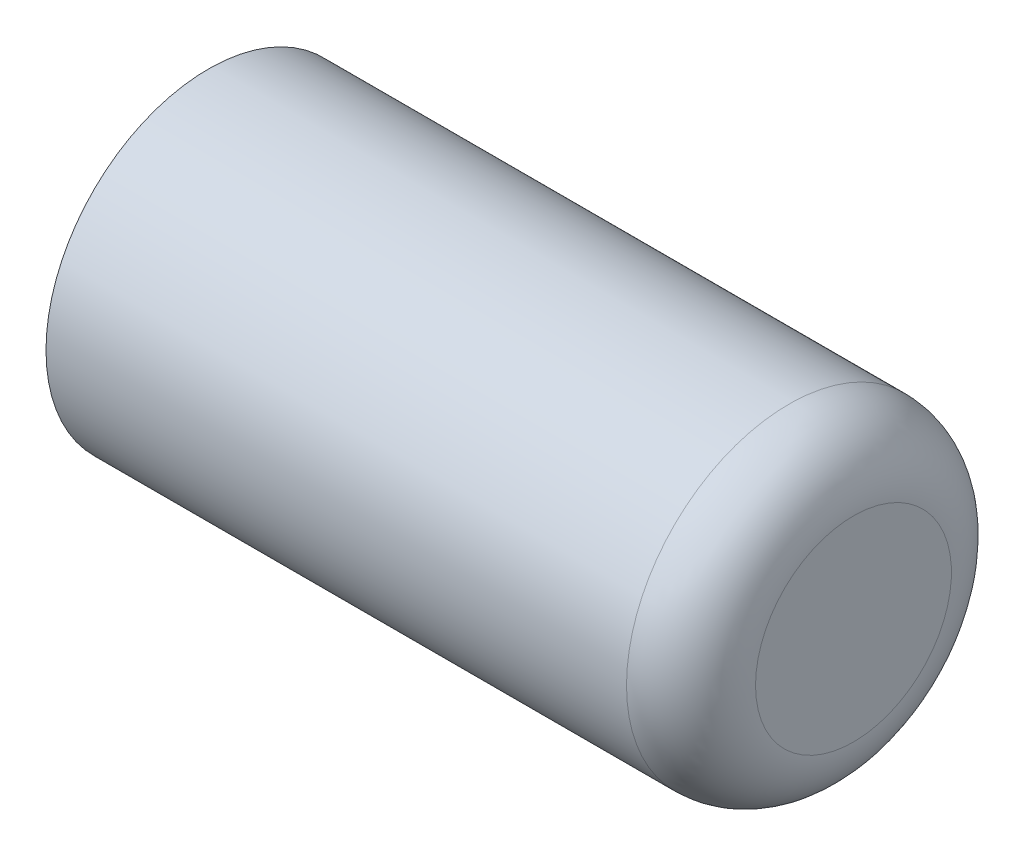
ISO-10303-21;
HEADER;
FILE_DESCRIPTION(('STEP AP214'),'2;1');
FILE_NAME('part.step','',(''),(''),'','','');
FILE_SCHEMA(('AUTOMOTIVE_DESIGN { 1 0 10303 214 1 1 1 1 }'));
ENDSEC;
DATA;
#1=APPLICATION_CONTEXT('core data for automotive mechanical design processes');
#2=APPLICATION_PROTOCOL_DEFINITION('international standard','automotive_design',2000,#1);
#3=PRODUCT_CONTEXT('',#1,'mechanical');
#4=PRODUCT('Part','Part','',(#3));
#5=PRODUCT_RELATED_PRODUCT_CATEGORY('part','',(#4));
#6=PRODUCT_DEFINITION_FORMATION('','',#4);
#7=PRODUCT_DEFINITION_CONTEXT('part definition',#1,'design');
#8=PRODUCT_DEFINITION('design','',#6,#7);
#9=PRODUCT_DEFINITION_SHAPE('','',#8);
#10=(LENGTH_UNIT() NAMED_UNIT(*) SI_UNIT(.MILLI.,.METRE.));
#11=(NAMED_UNIT(*) PLANE_ANGLE_UNIT() SI_UNIT($,.RADIAN.));
#12=(NAMED_UNIT(*) SI_UNIT($,.STERADIAN.) SOLID_ANGLE_UNIT());
#13=UNCERTAINTY_MEASURE_WITH_UNIT(LENGTH_MEASURE(1.E-05),#10,'distance_accuracy_value','');
#14=(GEOMETRIC_REPRESENTATION_CONTEXT(3) GLOBAL_UNCERTAINTY_ASSIGNED_CONTEXT((#13)) GLOBAL_UNIT_ASSIGNED_CONTEXT((#10,
#11,#12)) REPRESENTATION_CONTEXT('',''));
#15=CARTESIAN_POINT('',(0.,0.,0.));
#16=DIRECTION('',(0.,0.,1.));
#17=DIRECTION('',(1.,0.,0.));
#18=AXIS2_PLACEMENT_3D('',#15,#16,#17);
#19=CARTESIAN_POINT('',(127.,0.,0.));
#20=DIRECTION('',(-1.,0.,0.));
#21=DIRECTION('',(0.,0.,1.));
#22=AXIS2_PLACEMENT_3D('',#19,#20,#21);
#23=CYLINDRICAL_SURFACE('',#22,38.1);
#24=CARTESIAN_POINT('',(-127.,0.,0.));
#25=DIRECTION('',(-1.,0.,0.));
#26=DIRECTION('',(0.,0.,1.));
#27=AXIS2_PLACEMENT_3D('',#24,#25,#26);
#28=CIRCLE('',#27,38.1);
#29=CARTESIAN_POINT('',(-127.,0.,38.1));
#30=VERTEX_POINT('',#29);
#31=EDGE_CURVE('E53',#30,#30,#28,.T.);
#32=ORIENTED_EDGE('',*,*,#31,.T.);
#33=EDGE_LOOP('',(#32));
#34=FACE_BOUND('',#33,.T.);
#35=CARTESIAN_POINT('',(76.2,0.,0.));
#36=DIRECTION('',(1.,0.,0.));
#37=DIRECTION('',(0.,0.,-1.));
#38=AXIS2_PLACEMENT_3D('',#35,#36,#37);
#39=CIRCLE('',#38,38.1);
#40=CARTESIAN_POINT('',(76.2,0.,-38.1));
#41=VERTEX_POINT('',#40);
#42=EDGE_CURVE('E44',#41,#41,#39,.F.);
#43=ORIENTED_EDGE('',*,*,#42,.F.);
#44=EDGE_LOOP('',(#43));
#45=FACE_BOUND('',#44,.T.);
#46=ADVANCED_FACE('F33',(#34,#45),#23,.F.);
#47=CARTESIAN_POINT('',(127.,0.,0.));
#48=DIRECTION('',(-1.,0.,0.));
#49=DIRECTION('',(0.,0.,1.));
#50=AXIS2_PLACEMENT_3D('',#47,#48,#49);
#51=CYLINDRICAL_SURFACE('',#50,63.9767730092395);
#52=CARTESIAN_POINT('',(101.6,0.,0.));
#53=DIRECTION('',(-1.,0.,0.));
#54=DIRECTION('',(0.,0.,1.));
#55=AXIS2_PLACEMENT_3D('',#52,#53,#54);
#56=CIRCLE('',#55,63.9767730092395);
#57=CARTESIAN_POINT('',(101.6,0.,63.9767730092395));
#58=VERTEX_POINT('',#57);
#59=EDGE_CURVE('E40',#58,#58,#56,.T.);
#60=ORIENTED_EDGE('',*,*,#59,.T.);
#61=EDGE_LOOP('',(#60));
#62=FACE_BOUND('',#61,.T.);
#63=CARTESIAN_POINT('',(-127.,0.,0.));
#64=DIRECTION('',(-1.,0.,0.));
#65=DIRECTION('',(0.,0.,1.));
#66=AXIS2_PLACEMENT_3D('',#63,#64,#65);
#67=CIRCLE('',#66,63.9767730092395);
#68=CARTESIAN_POINT('',(-127.,0.,63.9767730092395));
#69=VERTEX_POINT('',#68);
#70=EDGE_CURVE('E48',#69,#69,#67,.T.);
#71=ORIENTED_EDGE('',*,*,#70,.F.);
#72=EDGE_LOOP('',(#71));
#73=FACE_BOUND('',#72,.T.);
#74=ADVANCED_FACE('F67',(#62,#73),#51,.T.);
#75=CARTESIAN_POINT('',(127.,0.,0.));
#76=DIRECTION('',(-1.,0.,0.));
#77=DIRECTION('',(0.,0.,1.));
#78=AXIS2_PLACEMENT_3D('',#75,#76,#77);
#79=PLANE('',#78);
#80=CARTESIAN_POINT('',(127.,0.,0.));
#81=DIRECTION('',(-1.,0.,0.));
#82=DIRECTION('',(0.,0.,1.));
#83=AXIS2_PLACEMENT_3D('',#80,#81,#82);
#84=CIRCLE('',#83,38.5767730092395);
#85=CARTESIAN_POINT('',(127.,0.,38.5767730092395));
#86=VERTEX_POINT('',#85);
#87=EDGE_CURVE('E10',#86,#86,#84,.F.);
#88=ORIENTED_EDGE('',*,*,#87,.T.);
#89=EDGE_LOOP('',(#88));
#90=FACE_BOUND('',#89,.T.);
#91=ADVANCED_FACE('F63',(#90),#79,.F.);
#92=CARTESIAN_POINT('',(-127.,0.,0.));
#93=DIRECTION('',(-1.,0.,0.));
#94=DIRECTION('',(0.,0.,1.));
#95=AXIS2_PLACEMENT_3D('',#92,#93,#94);
#96=PLANE('',#95);
#97=ORIENTED_EDGE('',*,*,#31,.F.);
#98=EDGE_LOOP('',(#97));
#99=FACE_BOUND('',#98,.T.);
#100=ORIENTED_EDGE('',*,*,#70,.T.);
#101=EDGE_LOOP('',(#100));
#102=FACE_BOUND('',#101,.T.);
#103=ADVANCED_FACE('F59',(#99,#102),#96,.T.);
#104=CARTESIAN_POINT('',(76.2,0.,0.));
#105=DIRECTION('',(1.,0.,0.));
#106=DIRECTION('',(0.,0.,-1.));
#107=AXIS2_PLACEMENT_3D('',#104,#105,#106);
#108=PLANE('',#107);
#109=ORIENTED_EDGE('',*,*,#42,.T.);
#110=EDGE_LOOP('',(#109));
#111=FACE_BOUND('',#110,.T.);
#112=ADVANCED_FACE('F62',(#111),#108,.F.);
#113=CARTESIAN_POINT('',(101.6,0.,0.));
#114=DIRECTION('',(-1.,0.,0.));
#115=DIRECTION('',(0.,0.,1.));
#116=AXIS2_PLACEMENT_3D('',#113,#114,#115);
#117=TOROIDAL_SURFACE('',#116,38.5767730092395,25.4);
#118=ORIENTED_EDGE('',*,*,#87,.F.);
#119=EDGE_LOOP('',(#118));
#120=FACE_BOUND('',#119,.T.);
#121=ORIENTED_EDGE('',*,*,#59,.F.);
#122=EDGE_LOOP('',(#121));
#123=FACE_BOUND('',#122,.T.);
#124=ADVANCED_FACE('F35',(#120,#123),#117,.T.);
#125=CLOSED_SHELL('',(#46,#74,#91,#103,#112,#124));
#126=MANIFOLD_SOLID_BREP('B2',#125);
#127=ADVANCED_BREP_SHAPE_REPRESENTATION('',(#18,#126),#14);
#128=SHAPE_DEFINITION_REPRESENTATION(#9,#127);
ENDSEC;
END-ISO-10303-21;
